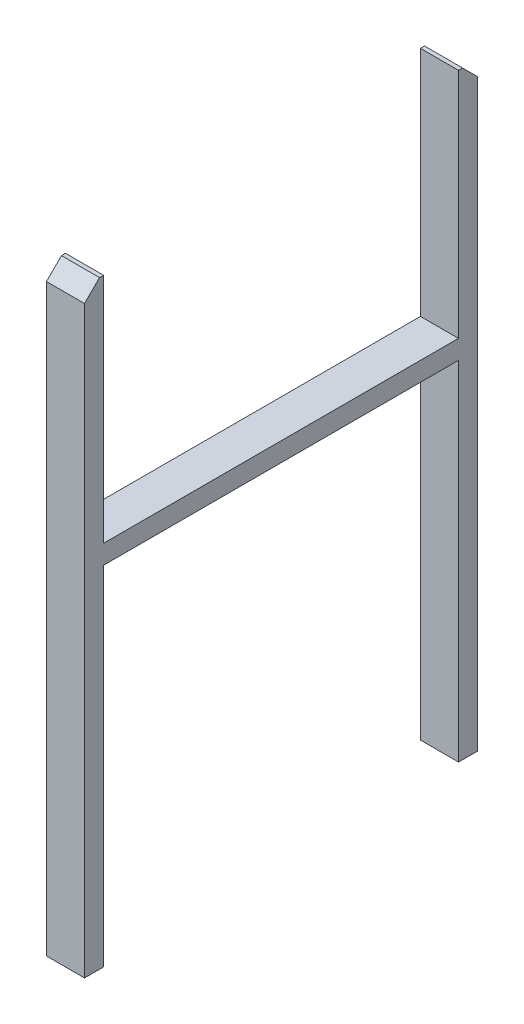
ISO-10303-21;
HEADER;
FILE_DESCRIPTION(('STEP AP214'),'2;1');
FILE_NAME('part.step','',(''),(''),'','','');
FILE_SCHEMA(('AUTOMOTIVE_DESIGN { 1 0 10303 214 1 1 1 1 }'));
ENDSEC;
DATA;
#1=APPLICATION_CONTEXT('core data for automotive mechanical design processes');
#2=APPLICATION_PROTOCOL_DEFINITION('international standard','automotive_design',2000,#1);
#3=PRODUCT_CONTEXT('',#1,'mechanical');
#4=PRODUCT('Part','Part','',(#3));
#5=PRODUCT_RELATED_PRODUCT_CATEGORY('part','',(#4));
#6=PRODUCT_DEFINITION_FORMATION('','',#4);
#7=PRODUCT_DEFINITION_CONTEXT('part definition',#1,'design');
#8=PRODUCT_DEFINITION('design','',#6,#7);
#9=PRODUCT_DEFINITION_SHAPE('','',#8);
#10=(LENGTH_UNIT() NAMED_UNIT(*) SI_UNIT(.MILLI.,.METRE.));
#11=(NAMED_UNIT(*) PLANE_ANGLE_UNIT() SI_UNIT($,.RADIAN.));
#12=(NAMED_UNIT(*) SI_UNIT($,.STERADIAN.) SOLID_ANGLE_UNIT());
#13=UNCERTAINTY_MEASURE_WITH_UNIT(LENGTH_MEASURE(1.E-05),#10,'distance_accuracy_value','');
#14=(GEOMETRIC_REPRESENTATION_CONTEXT(3) GLOBAL_UNCERTAINTY_ASSIGNED_CONTEXT((#13)) GLOBAL_UNIT_ASSIGNED_CONTEXT((#10,
#11,#12)) REPRESENTATION_CONTEXT('',''));
#15=CARTESIAN_POINT('',(0.,0.,0.));
#16=DIRECTION('',(0.,0.,1.));
#17=DIRECTION('',(1.,0.,0.));
#18=AXIS2_PLACEMENT_3D('',#15,#16,#17);
#19=CARTESIAN_POINT('',(0.,800.,0.));
#20=DIRECTION('',(0.,0.,1.));
#21=DIRECTION('',(1.,0.,0.));
#22=AXIS2_PLACEMENT_3D('',#19,#20,#21);
#23=PLANE('',#22);
#24=DIRECTION('',(0.,-1.,0.));
#25=VECTOR('',#24,1.);
#26=CARTESIAN_POINT('',(50.8,800.,0.));
#27=LINE('',#26,#25);
#28=CARTESIAN_POINT('',(50.8,800.,0.));
#29=VERTEX_POINT('',#28);
#30=CARTESIAN_POINT('',(50.8,490.,0.));
#31=VERTEX_POINT('',#30);
#32=EDGE_CURVE('E205',#29,#31,#27,.T.);
#33=ORIENTED_EDGE('',*,*,#32,.T.);
#34=DIRECTION('',(-1.,0.,0.));
#35=VECTOR('',#34,1.);
#36=CARTESIAN_POINT('',(0.,490.,0.));
#37=LINE('',#36,#35);
#38=CARTESIAN_POINT('',(0.,490.,0.));
#39=VERTEX_POINT('',#38);
#40=EDGE_CURVE('E167',#31,#39,#37,.T.);
#41=ORIENTED_EDGE('',*,*,#40,.T.);
#42=DIRECTION('',(0.,-1.,0.));
#43=VECTOR('',#42,1.);
#44=CARTESIAN_POINT('',(0.,800.,0.));
#45=LINE('',#44,#43);
#46=CARTESIAN_POINT('',(0.,800.,0.));
#47=VERTEX_POINT('',#46);
#48=EDGE_CURVE('E213',#47,#39,#45,.T.);
#49=ORIENTED_EDGE('',*,*,#48,.F.);
#50=DIRECTION('',(-1.,0.,0.));
#51=VECTOR('',#50,1.);
#52=CARTESIAN_POINT('',(0.,800.,0.));
#53=LINE('',#52,#51);
#54=EDGE_CURVE('E185',#29,#47,#53,.T.);
#55=ORIENTED_EDGE('',*,*,#54,.F.);
#56=EDGE_LOOP('',(#33,#41,#49,#55));
#57=FACE_BOUND('',#56,.T.);
#58=ADVANCED_FACE('F37',(#57),#23,.F.);
#59=CARTESIAN_POINT('',(0.,464.6,0.));
#60=VERTEX_POINT('',#59);
#61=CARTESIAN_POINT('',(0.,0.,0.));
#62=VERTEX_POINT('',#61);
#63=EDGE_CURVE('E212',#60,#62,#45,.T.);
#64=ORIENTED_EDGE('',*,*,#63,.F.);
#65=DIRECTION('',(1.,0.,0.));
#66=VECTOR('',#65,1.);
#67=CARTESIAN_POINT('',(0.,464.6,0.));
#68=LINE('',#67,#66);
#69=CARTESIAN_POINT('',(50.8,464.6,0.));
#70=VERTEX_POINT('',#69);
#71=EDGE_CURVE('E173',#60,#70,#68,.T.);
#72=ORIENTED_EDGE('',*,*,#71,.T.);
#73=CARTESIAN_POINT('',(50.8,0.,0.));
#74=VERTEX_POINT('',#73);
#75=EDGE_CURVE('E194',#70,#74,#27,.T.);
#76=ORIENTED_EDGE('',*,*,#75,.T.);
#77=DIRECTION('',(-1.,0.,0.));
#78=VECTOR('',#77,1.);
#79=CARTESIAN_POINT('',(0.,0.,0.));
#80=LINE('',#79,#78);
#81=EDGE_CURVE('E176',#74,#62,#80,.T.);
#82=ORIENTED_EDGE('',*,*,#81,.T.);
#83=EDGE_LOOP('',(#64,#72,#76,#82));
#84=FACE_BOUND('',#83,.T.);
#85=ADVANCED_FACE('F251',(#84),#23,.F.);
#86=CARTESIAN_POINT('',(0.,800.,0.));
#87=DIRECTION('',(1.,0.,0.));
#88=DIRECTION('',(0.,0.,-1.));
#89=AXIS2_PLACEMENT_3D('',#86,#87,#88);
#90=PLANE('',#89);
#91=DIRECTION('',(0.,-1.,0.));
#92=VECTOR('',#91,1.);
#93=CARTESIAN_POINT('',(0.,800.,25.4));
#94=LINE('',#93,#92);
#95=CARTESIAN_POINT('',(0.,780.,25.4));
#96=VERTEX_POINT('',#95);
#97=CARTESIAN_POINT('',(0.,0.,25.4));
#98=VERTEX_POINT('',#97);
#99=EDGE_CURVE('E210',#96,#98,#94,.T.);
#100=ORIENTED_EDGE('',*,*,#99,.F.);
#101=DIRECTION('',(0.,-0.707106781186549,0.707106781186546));
#102=VECTOR('',#101,1.);
#103=CARTESIAN_POINT('',(0.,800.,5.40000000000009));
#104=LINE('',#103,#102);
#105=CARTESIAN_POINT('',(0.,800.,5.40000000000009));
#106=VERTEX_POINT('',#105);
#107=EDGE_CURVE('E225',#96,#106,#104,.F.);
#108=ORIENTED_EDGE('',*,*,#107,.T.);
#109=DIRECTION('',(0.,0.,1.));
#110=VECTOR('',#109,1.);
#111=CARTESIAN_POINT('',(0.,800.,0.));
#112=LINE('',#111,#110);
#113=EDGE_CURVE('E188',#47,#106,#112,.T.);
#114=ORIENTED_EDGE('',*,*,#113,.F.);
#115=ORIENTED_EDGE('',*,*,#48,.T.);
#116=DIRECTION('',(0.,0.,-1.));
#117=VECTOR('',#116,1.);
#118=CARTESIAN_POINT('',(0.,490.,56.7961266284946));
#119=LINE('',#118,#117);
#120=CARTESIAN_POINT('',(0.,490.,-474.));
#121=VERTEX_POINT('',#120);
#122=EDGE_CURVE('E156',#39,#121,#119,.T.);
#123=ORIENTED_EDGE('',*,*,#122,.T.);
#124=DIRECTION('',(0.,-1.,0.));
#125=VECTOR('',#124,1.);
#126=CARTESIAN_POINT('',(0.,800.,-474.));
#127=LINE('',#126,#125);
#128=CARTESIAN_POINT('',(0.,800.,-474.));
#129=VERTEX_POINT('',#128);
#130=EDGE_CURVE('E146',#129,#121,#127,.T.);
#131=ORIENTED_EDGE('',*,*,#130,.F.);
#132=DIRECTION('',(0.,0.,1.));
#133=VECTOR('',#132,1.);
#134=CARTESIAN_POINT('',(0.,800.,-474.));
#135=LINE('',#134,#133);
#136=CARTESIAN_POINT('',(0.,800.,-479.4));
#137=VERTEX_POINT('',#136);
#138=EDGE_CURVE('E135',#137,#129,#135,.T.);
#139=ORIENTED_EDGE('',*,*,#138,.F.);
#140=DIRECTION('',(0.,0.707106781186549,0.707106781186546));
#141=VECTOR('',#140,1.);
#142=CARTESIAN_POINT('',(0.,800.,-479.4));
#143=LINE('',#142,#141);
#144=CARTESIAN_POINT('',(0.,780.,-499.4));
#145=VERTEX_POINT('',#144);
#146=EDGE_CURVE('E52',#137,#145,#143,.F.);
#147=ORIENTED_EDGE('',*,*,#146,.T.);
#148=DIRECTION('',(0.,-1.,0.));
#149=VECTOR('',#148,1.);
#150=CARTESIAN_POINT('',(0.,800.,-499.4));
#151=LINE('',#150,#149);
#152=CARTESIAN_POINT('',(0.,0.,-499.4));
#153=VERTEX_POINT('',#152);
#154=EDGE_CURVE('E277',#145,#153,#151,.T.);
#155=ORIENTED_EDGE('',*,*,#154,.T.);
#156=DIRECTION('',(0.,0.,1.));
#157=VECTOR('',#156,1.);
#158=CARTESIAN_POINT('',(0.,0.,-474.));
#159=LINE('',#158,#157);
#160=CARTESIAN_POINT('',(0.,0.,-474.));
#161=VERTEX_POINT('',#160);
#162=EDGE_CURVE('E258',#153,#161,#159,.T.);
#163=ORIENTED_EDGE('',*,*,#162,.T.);
#164=CARTESIAN_POINT('',(0.,464.6,-474.));
#165=VERTEX_POINT('',#164);
#166=EDGE_CURVE('E158',#165,#161,#127,.T.);
#167=ORIENTED_EDGE('',*,*,#166,.F.);
#168=DIRECTION('',(0.,0.,-1.));
#169=VECTOR('',#168,1.);
#170=CARTESIAN_POINT('',(0.,464.6,56.7961266284946));
#171=LINE('',#170,#169);
#172=EDGE_CURVE('E160',#60,#165,#171,.T.);
#173=ORIENTED_EDGE('',*,*,#172,.F.);
#174=ORIENTED_EDGE('',*,*,#63,.T.);
#175=DIRECTION('',(0.,0.,1.));
#176=VECTOR('',#175,1.);
#177=CARTESIAN_POINT('',(0.,0.,0.));
#178=LINE('',#177,#176);
#179=EDGE_CURVE('E197',#62,#98,#178,.T.);
#180=ORIENTED_EDGE('',*,*,#179,.T.);
#181=EDGE_LOOP('',(#100,#108,#114,#115,#123,#131,#139,#147,#155,#163,#167,#173,#174,#180));
#182=FACE_BOUND('',#181,.T.);
#183=ADVANCED_FACE('F154',(#182),#90,.F.);
#184=CARTESIAN_POINT('',(0.,800.,25.4));
#185=DIRECTION('',(0.,0.,-1.));
#186=DIRECTION('',(-1.,0.,0.));
#187=AXIS2_PLACEMENT_3D('',#184,#185,#186);
#188=PLANE('',#187);
#189=DIRECTION('',(0.,-1.,0.));
#190=VECTOR('',#189,1.);
#191=CARTESIAN_POINT('',(50.8,800.,25.4));
#192=LINE('',#191,#190);
#193=CARTESIAN_POINT('',(50.8,780.,25.4));
#194=VERTEX_POINT('',#193);
#195=CARTESIAN_POINT('',(50.8,0.,25.4));
#196=VERTEX_POINT('',#195);
#197=EDGE_CURVE('E208',#194,#196,#192,.T.);
#198=ORIENTED_EDGE('',*,*,#197,.F.);
#199=DIRECTION('',(-1.,0.,0.));
#200=VECTOR('',#199,1.);
#201=CARTESIAN_POINT('',(0.,780.,25.4));
#202=LINE('',#201,#200);
#203=EDGE_CURVE('E222',#194,#96,#202,.T.);
#204=ORIENTED_EDGE('',*,*,#203,.T.);
#205=ORIENTED_EDGE('',*,*,#99,.T.);
#206=DIRECTION('',(1.,0.,0.));
#207=VECTOR('',#206,1.);
#208=CARTESIAN_POINT('',(0.,0.,25.4));
#209=LINE('',#208,#207);
#210=EDGE_CURVE('E200',#98,#196,#209,.T.);
#211=ORIENTED_EDGE('',*,*,#210,.T.);
#212=EDGE_LOOP('',(#198,#204,#205,#211));
#213=FACE_BOUND('',#212,.T.);
#214=ADVANCED_FACE('F241',(#213),#188,.F.);
#215=CARTESIAN_POINT('',(50.8,800.,0.));
#216=DIRECTION('',(-1.,0.,0.));
#217=DIRECTION('',(0.,0.,1.));
#218=AXIS2_PLACEMENT_3D('',#215,#216,#217);
#219=PLANE('',#218);
#220=DIRECTION('',(0.,0.,-1.));
#221=VECTOR('',#220,1.);
#222=CARTESIAN_POINT('',(50.8,800.,0.));
#223=LINE('',#222,#221);
#224=CARTESIAN_POINT('',(50.8,800.,5.40000000000009));
#225=VERTEX_POINT('',#224);
#226=EDGE_CURVE('E192',#225,#29,#223,.T.);
#227=ORIENTED_EDGE('',*,*,#226,.F.);
#228=DIRECTION('',(0.,0.707106781186549,-0.707106781186546));
#229=VECTOR('',#228,1.);
#230=CARTESIAN_POINT('',(50.8,800.,5.40000000000009));
#231=LINE('',#230,#229);
#232=EDGE_CURVE('E220',#225,#194,#231,.F.);
#233=ORIENTED_EDGE('',*,*,#232,.T.);
#234=ORIENTED_EDGE('',*,*,#197,.T.);
#235=DIRECTION('',(0.,0.,-1.));
#236=VECTOR('',#235,1.);
#237=CARTESIAN_POINT('',(50.8,0.,0.));
#238=LINE('',#237,#236);
#239=EDGE_CURVE('E189',#196,#74,#238,.T.);
#240=ORIENTED_EDGE('',*,*,#239,.T.);
#241=ORIENTED_EDGE('',*,*,#75,.F.);
#242=DIRECTION('',(0.,0.,-1.));
#243=VECTOR('',#242,1.);
#244=CARTESIAN_POINT('',(50.8,464.6,56.7961266284946));
#245=LINE('',#244,#243);
#246=CARTESIAN_POINT('',(50.8,464.6,-474.));
#247=VERTEX_POINT('',#246);
#248=EDGE_CURVE('E172',#70,#247,#245,.T.);
#249=ORIENTED_EDGE('',*,*,#248,.T.);
#250=DIRECTION('',(0.,-1.,0.));
#251=VECTOR('',#250,1.);
#252=CARTESIAN_POINT('',(50.8,800.,-474.));
#253=LINE('',#252,#251);
#254=CARTESIAN_POINT('',(50.8,0.,-474.));
#255=VERTEX_POINT('',#254);
#256=EDGE_CURVE('E279',#247,#255,#253,.T.);
#257=ORIENTED_EDGE('',*,*,#256,.T.);
#258=DIRECTION('',(0.,0.,-1.));
#259=VECTOR('',#258,1.);
#260=CARTESIAN_POINT('',(50.8,0.,-474.));
#261=LINE('',#260,#259);
#262=CARTESIAN_POINT('',(50.8,0.,-499.4));
#263=VERTEX_POINT('',#262);
#264=EDGE_CURVE('E269',#255,#263,#261,.T.);
#265=ORIENTED_EDGE('',*,*,#264,.T.);
#266=DIRECTION('',(0.,-1.,0.));
#267=VECTOR('',#266,1.);
#268=CARTESIAN_POINT('',(50.8,800.,-499.4));
#269=LINE('',#268,#267);
#270=CARTESIAN_POINT('',(50.8,780.,-499.4));
#271=VERTEX_POINT('',#270);
#272=EDGE_CURVE('E278',#271,#263,#269,.T.);
#273=ORIENTED_EDGE('',*,*,#272,.F.);
#274=DIRECTION('',(0.,-0.707106781186549,-0.707106781186546));
#275=VECTOR('',#274,1.);
#276=CARTESIAN_POINT('',(50.8,800.,-479.4));
#277=LINE('',#276,#275);
#278=CARTESIAN_POINT('',(50.8,800.,-479.4));
#279=VERTEX_POINT('',#278);
#280=EDGE_CURVE('E218',#271,#279,#277,.F.);
#281=ORIENTED_EDGE('',*,*,#280,.T.);
#282=DIRECTION('',(0.,0.,-1.));
#283=VECTOR('',#282,1.);
#284=CARTESIAN_POINT('',(50.8,800.,-474.));
#285=LINE('',#284,#283);
#286=CARTESIAN_POINT('',(50.8,800.,-474.));
#287=VERTEX_POINT('',#286);
#288=EDGE_CURVE('E151',#287,#279,#285,.T.);
#289=ORIENTED_EDGE('',*,*,#288,.F.);
#290=CARTESIAN_POINT('',(50.8,490.,-474.));
#291=VERTEX_POINT('',#290);
#292=EDGE_CURVE('E149',#287,#291,#253,.T.);
#293=ORIENTED_EDGE('',*,*,#292,.T.);
#294=DIRECTION('',(0.,0.,-1.));
#295=VECTOR('',#294,1.);
#296=CARTESIAN_POINT('',(50.8,490.,56.7961266284946));
#297=LINE('',#296,#295);
#298=EDGE_CURVE('E168',#31,#291,#297,.T.);
#299=ORIENTED_EDGE('',*,*,#298,.F.);
#300=ORIENTED_EDGE('',*,*,#32,.F.);
#301=EDGE_LOOP('',(#227,#233,#234,#240,#241,#249,#257,#265,#273,#281,#289,#293,#299,#300));
#302=FACE_BOUND('',#301,.T.);
#303=ADVANCED_FACE('F238',(#302),#219,.F.);
#304=CARTESIAN_POINT('',(0.,800.,0.));
#305=DIRECTION('',(0.,-1.,0.));
#306=DIRECTION('',(0.,0.,-1.));
#307=AXIS2_PLACEMENT_3D('',#304,#305,#306);
#308=PLANE('',#307);
#309=ORIENTED_EDGE('',*,*,#113,.T.);
#310=DIRECTION('',(1.,0.,0.));
#311=VECTOR('',#310,1.);
#312=CARTESIAN_POINT('',(0.,800.,5.40000000000009));
#313=LINE('',#312,#311);
#314=EDGE_CURVE('E215',#106,#225,#313,.T.);
#315=ORIENTED_EDGE('',*,*,#314,.T.);
#316=ORIENTED_EDGE('',*,*,#226,.T.);
#317=ORIENTED_EDGE('',*,*,#54,.T.);
#318=EDGE_LOOP('',(#309,#315,#316,#317));
#319=FACE_BOUND('',#318,.T.);
#320=ADVANCED_FACE('F231',(#319),#308,.F.);
#321=CARTESIAN_POINT('',(0.,0.,0.));
#322=DIRECTION('',(0.,-1.,0.));
#323=DIRECTION('',(0.,0.,-1.));
#324=AXIS2_PLACEMENT_3D('',#321,#322,#323);
#325=PLANE('',#324);
#326=ORIENTED_EDGE('',*,*,#81,.F.);
#327=ORIENTED_EDGE('',*,*,#239,.F.);
#328=ORIENTED_EDGE('',*,*,#210,.F.);
#329=ORIENTED_EDGE('',*,*,#179,.F.);
#330=EDGE_LOOP('',(#326,#327,#328,#329));
#331=FACE_BOUND('',#330,.T.);
#332=ADVANCED_FACE('F247',(#331),#325,.T.);
#333=CARTESIAN_POINT('',(0.,464.6,56.7961266284946));
#334=DIRECTION('',(0.,1.,0.));
#335=DIRECTION('',(0.,0.,1.));
#336=AXIS2_PLACEMENT_3D('',#333,#334,#335);
#337=PLANE('',#336);
#338=ORIENTED_EDGE('',*,*,#71,.F.);
#339=ORIENTED_EDGE('',*,*,#172,.T.);
#340=DIRECTION('',(1.,0.,0.));
#341=VECTOR('',#340,1.);
#342=CARTESIAN_POINT('',(0.,464.6,-474.));
#343=LINE('',#342,#341);
#344=EDGE_CURVE('E169',#165,#247,#343,.T.);
#345=ORIENTED_EDGE('',*,*,#344,.T.);
#346=ORIENTED_EDGE('',*,*,#248,.F.);
#347=EDGE_LOOP('',(#338,#339,#345,#346));
#348=FACE_BOUND('',#347,.T.);
#349=ADVANCED_FACE('F254',(#348),#337,.F.);
#350=CARTESIAN_POINT('',(0.,490.,56.7961266284946));
#351=DIRECTION('',(0.,-1.,0.));
#352=DIRECTION('',(0.,0.,-1.));
#353=AXIS2_PLACEMENT_3D('',#350,#351,#352);
#354=PLANE('',#353);
#355=ORIENTED_EDGE('',*,*,#40,.F.);
#356=ORIENTED_EDGE('',*,*,#298,.T.);
#357=DIRECTION('',(-1.,0.,0.));
#358=VECTOR('',#357,1.);
#359=CARTESIAN_POINT('',(0.,490.,-474.));
#360=LINE('',#359,#358);
#361=EDGE_CURVE('E165',#291,#121,#360,.T.);
#362=ORIENTED_EDGE('',*,*,#361,.T.);
#363=ORIENTED_EDGE('',*,*,#122,.F.);
#364=EDGE_LOOP('',(#355,#356,#362,#363));
#365=FACE_BOUND('',#364,.T.);
#366=ADVANCED_FACE('F284',(#365),#354,.F.);
#367=CARTESIAN_POINT('',(0.,800.,-474.));
#368=DIRECTION('',(0.,0.,-1.));
#369=DIRECTION('',(-1.,0.,0.));
#370=AXIS2_PLACEMENT_3D('',#367,#368,#369);
#371=PLANE('',#370);
#372=ORIENTED_EDGE('',*,*,#361,.F.);
#373=ORIENTED_EDGE('',*,*,#292,.F.);
#374=DIRECTION('',(1.,0.,0.));
#375=VECTOR('',#374,1.);
#376=CARTESIAN_POINT('',(0.,800.,-474.));
#377=LINE('',#376,#375);
#378=EDGE_CURVE('E139',#129,#287,#377,.T.);
#379=ORIENTED_EDGE('',*,*,#378,.F.);
#380=ORIENTED_EDGE('',*,*,#130,.T.);
#381=EDGE_LOOP('',(#372,#373,#379,#380));
#382=FACE_BOUND('',#381,.T.);
#383=ADVANCED_FACE('F145',(#382),#371,.F.);
#384=ORIENTED_EDGE('',*,*,#344,.F.);
#385=ORIENTED_EDGE('',*,*,#166,.T.);
#386=DIRECTION('',(1.,0.,0.));
#387=VECTOR('',#386,1.);
#388=CARTESIAN_POINT('',(0.,0.,-474.));
#389=LINE('',#388,#387);
#390=EDGE_CURVE('E263',#161,#255,#389,.T.);
#391=ORIENTED_EDGE('',*,*,#390,.T.);
#392=ORIENTED_EDGE('',*,*,#256,.F.);
#393=EDGE_LOOP('',(#384,#385,#391,#392));
#394=FACE_BOUND('',#393,.T.);
#395=ADVANCED_FACE('F262',(#394),#371,.F.);
#396=CARTESIAN_POINT('',(0.,800.,-499.4));
#397=DIRECTION('',(0.,0.,1.));
#398=DIRECTION('',(1.,0.,0.));
#399=AXIS2_PLACEMENT_3D('',#396,#397,#398);
#400=PLANE('',#399);
#401=ORIENTED_EDGE('',*,*,#154,.F.);
#402=DIRECTION('',(1.,0.,0.));
#403=VECTOR('',#402,1.);
#404=CARTESIAN_POINT('',(0.,780.,-499.4));
#405=LINE('',#404,#403);
#406=EDGE_CURVE('E11',#145,#271,#405,.T.);
#407=ORIENTED_EDGE('',*,*,#406,.T.);
#408=ORIENTED_EDGE('',*,*,#272,.T.);
#409=DIRECTION('',(-1.,0.,0.));
#410=VECTOR('',#409,1.);
#411=CARTESIAN_POINT('',(0.,0.,-499.4));
#412=LINE('',#411,#410);
#413=EDGE_CURVE('E142',#263,#153,#412,.T.);
#414=ORIENTED_EDGE('',*,*,#413,.T.);
#415=EDGE_LOOP('',(#401,#407,#408,#414));
#416=FACE_BOUND('',#415,.T.);
#417=ADVANCED_FACE('F302',(#416),#400,.F.);
#418=CARTESIAN_POINT('',(0.,800.,0.));
#419=DIRECTION('',(0.,-1.,0.));
#420=DIRECTION('',(0.,0.,-1.));
#421=AXIS2_PLACEMENT_3D('',#418,#419,#420);
#422=PLANE('',#421);
#423=ORIENTED_EDGE('',*,*,#288,.T.);
#424=DIRECTION('',(-1.,0.,0.));
#425=VECTOR('',#424,1.);
#426=CARTESIAN_POINT('',(0.,800.,-479.4));
#427=LINE('',#426,#425);
#428=EDGE_CURVE('E45',#279,#137,#427,.T.);
#429=ORIENTED_EDGE('',*,*,#428,.T.);
#430=ORIENTED_EDGE('',*,*,#138,.T.);
#431=ORIENTED_EDGE('',*,*,#378,.T.);
#432=EDGE_LOOP('',(#423,#429,#430,#431));
#433=FACE_BOUND('',#432,.T.);
#434=ADVANCED_FACE('F138',(#433),#422,.F.);
#435=CARTESIAN_POINT('',(0.,0.,0.));
#436=DIRECTION('',(0.,-1.,0.));
#437=DIRECTION('',(0.,0.,-1.));
#438=AXIS2_PLACEMENT_3D('',#435,#436,#437);
#439=PLANE('',#438);
#440=ORIENTED_EDGE('',*,*,#162,.F.);
#441=ORIENTED_EDGE('',*,*,#413,.F.);
#442=ORIENTED_EDGE('',*,*,#264,.F.);
#443=ORIENTED_EDGE('',*,*,#390,.F.);
#444=EDGE_LOOP('',(#440,#441,#442,#443));
#445=FACE_BOUND('',#444,.T.);
#446=ADVANCED_FACE('F266',(#445),#439,.T.);
#447=CARTESIAN_POINT('',(0.,800.,5.40000000000009));
#448=DIRECTION('',(0.,-0.707106781186546,-0.707106781186549));
#449=DIRECTION('',(1.,0.,0.));
#450=AXIS2_PLACEMENT_3D('',#447,#448,#449);
#451=PLANE('',#450);
#452=ORIENTED_EDGE('',*,*,#107,.F.);
#453=ORIENTED_EDGE('',*,*,#203,.F.);
#454=ORIENTED_EDGE('',*,*,#232,.F.);
#455=ORIENTED_EDGE('',*,*,#314,.F.);
#456=EDGE_LOOP('',(#452,#453,#454,#455));
#457=FACE_BOUND('',#456,.T.);
#458=ADVANCED_FACE('F235',(#457),#451,.F.);
#459=CARTESIAN_POINT('',(0.,800.,-479.4));
#460=DIRECTION('',(0.,-0.707106781186545,0.707106781186549));
#461=DIRECTION('',(-1.,0.,0.));
#462=AXIS2_PLACEMENT_3D('',#459,#460,#461);
#463=PLANE('',#462);
#464=ORIENTED_EDGE('',*,*,#280,.F.);
#465=ORIENTED_EDGE('',*,*,#406,.F.);
#466=ORIENTED_EDGE('',*,*,#146,.F.);
#467=ORIENTED_EDGE('',*,*,#428,.F.);
#468=EDGE_LOOP('',(#464,#465,#466,#467));
#469=FACE_BOUND('',#468,.T.);
#470=ADVANCED_FACE('F39',(#469),#463,.F.);
#471=CLOSED_SHELL('',(#58,#85,#183,#214,#303,#320,#332,#349,#366,#383,#395,#417,#434,#446,#458,#470));
#472=MANIFOLD_SOLID_BREP('B2',#471);
#473=ADVANCED_BREP_SHAPE_REPRESENTATION('',(#18,#472),#14);
#474=SHAPE_DEFINITION_REPRESENTATION(#9,#473);
ENDSEC;
END-ISO-10303-21;
